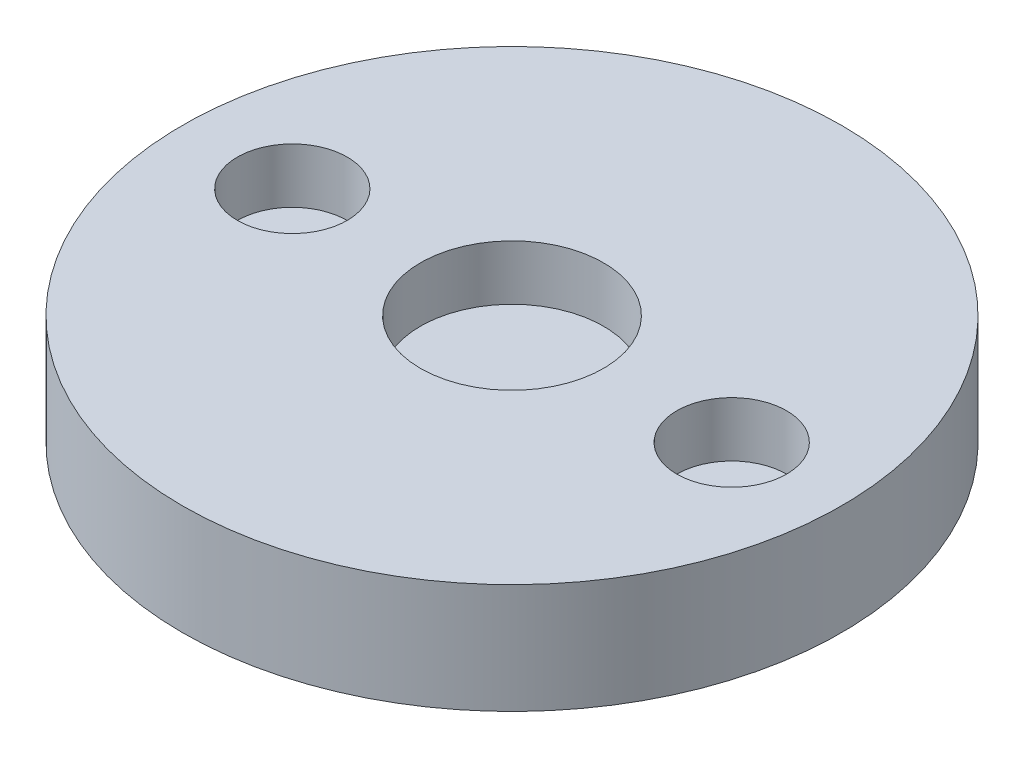
ISO-10303-21;
HEADER;
FILE_DESCRIPTION(('STEP AP214'),'2;1');
FILE_NAME('part.step','',(''),(''),'','','');
FILE_SCHEMA(('AUTOMOTIVE_DESIGN { 1 0 10303 214 1 1 1 1 }'));
ENDSEC;
DATA;
#1=APPLICATION_CONTEXT('core data for automotive mechanical design processes');
#2=APPLICATION_PROTOCOL_DEFINITION('international standard','automotive_design',2000,#1);
#3=PRODUCT_CONTEXT('',#1,'mechanical');
#4=PRODUCT('Part','Part','',(#3));
#5=PRODUCT_RELATED_PRODUCT_CATEGORY('part','',(#4));
#6=PRODUCT_DEFINITION_FORMATION('','',#4);
#7=PRODUCT_DEFINITION_CONTEXT('part definition',#1,'design');
#8=PRODUCT_DEFINITION('design','',#6,#7);
#9=PRODUCT_DEFINITION_SHAPE('','',#8);
#10=(LENGTH_UNIT() NAMED_UNIT(*) SI_UNIT(.MILLI.,.METRE.));
#11=(NAMED_UNIT(*) PLANE_ANGLE_UNIT() SI_UNIT($,.RADIAN.));
#12=(NAMED_UNIT(*) SI_UNIT($,.STERADIAN.) SOLID_ANGLE_UNIT());
#13=UNCERTAINTY_MEASURE_WITH_UNIT(LENGTH_MEASURE(1.E-05),#10,'distance_accuracy_value','');
#14=(GEOMETRIC_REPRESENTATION_CONTEXT(3) GLOBAL_UNCERTAINTY_ASSIGNED_CONTEXT((#13)) GLOBAL_UNIT_ASSIGNED_CONTEXT((#10,
#11,#12)) REPRESENTATION_CONTEXT('',''));
#15=CARTESIAN_POINT('',(0.,0.,0.));
#16=DIRECTION('',(0.,0.,1.));
#17=DIRECTION('',(1.,0.,0.));
#18=AXIS2_PLACEMENT_3D('',#15,#16,#17);
#19=CARTESIAN_POINT('',(0.,3.,0.));
#20=DIRECTION('',(0.,-1.,0.));
#21=DIRECTION('',(0.,0.,-1.));
#22=AXIS2_PLACEMENT_3D('',#19,#20,#21);
#23=CYLINDRICAL_SURFACE('',#22,9.);
#24=CARTESIAN_POINT('',(0.,3.,0.));
#25=DIRECTION('',(0.,1.,0.));
#26=DIRECTION('',(0.,0.,1.));
#27=AXIS2_PLACEMENT_3D('',#24,#25,#26);
#28=CIRCLE('',#27,9.);
#29=CARTESIAN_POINT('',(0.,3.,9.));
#30=VERTEX_POINT('',#29);
#31=EDGE_CURVE('E12',#30,#30,#28,.T.);
#32=ORIENTED_EDGE('',*,*,#31,.F.);
#33=EDGE_LOOP('',(#32));
#34=FACE_BOUND('',#33,.T.);
#35=CARTESIAN_POINT('',(0.,0.,0.));
#36=DIRECTION('',(0.,1.,0.));
#37=DIRECTION('',(0.,0.,1.));
#38=AXIS2_PLACEMENT_3D('',#35,#36,#37);
#39=CIRCLE('',#38,9.);
#40=CARTESIAN_POINT('',(0.,0.,9.));
#41=VERTEX_POINT('',#40);
#42=EDGE_CURVE('E46',#41,#41,#39,.T.);
#43=ORIENTED_EDGE('',*,*,#42,.T.);
#44=EDGE_LOOP('',(#43));
#45=FACE_BOUND('',#44,.T.);
#46=ADVANCED_FACE('F43',(#34,#45),#23,.T.);
#47=CARTESIAN_POINT('',(0.,3.,0.));
#48=DIRECTION('',(0.,1.,0.));
#49=DIRECTION('',(0.,0.,1.));
#50=AXIS2_PLACEMENT_3D('',#47,#48,#49);
#51=PLANE('',#50);
#52=CARTESIAN_POINT('',(6.,3.,0.));
#53=DIRECTION('',(0.,1.,0.));
#54=DIRECTION('',(0.,0.,1.));
#55=AXIS2_PLACEMENT_3D('',#52,#53,#54);
#56=CIRCLE('',#55,1.5);
#57=CARTESIAN_POINT('',(6.,3.,1.5));
#58=VERTEX_POINT('',#57);
#59=EDGE_CURVE('E61',#58,#58,#56,.T.);
#60=ORIENTED_EDGE('',*,*,#59,.F.);
#61=EDGE_LOOP('',(#60));
#62=FACE_BOUND('',#61,.T.);
#63=CARTESIAN_POINT('',(-6.,3.,0.));
#64=DIRECTION('',(0.,1.,0.));
#65=DIRECTION('',(0.,0.,1.));
#66=AXIS2_PLACEMENT_3D('',#63,#64,#65);
#67=CIRCLE('',#66,1.5);
#68=CARTESIAN_POINT('',(-6.,3.,1.5));
#69=VERTEX_POINT('',#68);
#70=EDGE_CURVE('E67',#69,#69,#67,.T.);
#71=ORIENTED_EDGE('',*,*,#70,.F.);
#72=EDGE_LOOP('',(#71));
#73=FACE_BOUND('',#72,.T.);
#74=CARTESIAN_POINT('',(0.,3.,0.));
#75=DIRECTION('',(0.,1.,0.));
#76=DIRECTION('',(0.,0.,1.));
#77=AXIS2_PLACEMENT_3D('',#74,#75,#76);
#78=CIRCLE('',#77,2.5);
#79=CARTESIAN_POINT('',(0.,3.,2.5));
#80=VERTEX_POINT('',#79);
#81=EDGE_CURVE('E55',#80,#80,#78,.T.);
#82=ORIENTED_EDGE('',*,*,#81,.F.);
#83=EDGE_LOOP('',(#82));
#84=FACE_BOUND('',#83,.T.);
#85=ORIENTED_EDGE('',*,*,#31,.T.);
#86=EDGE_LOOP('',(#85));
#87=FACE_BOUND('',#86,.T.);
#88=ADVANCED_FACE('F82',(#62,#73,#84,#87),#51,.T.);
#89=CARTESIAN_POINT('',(0.,0.,0.));
#90=DIRECTION('',(0.,1.,0.));
#91=DIRECTION('',(0.,0.,1.));
#92=AXIS2_PLACEMENT_3D('',#89,#90,#91);
#93=PLANE('',#92);
#94=ORIENTED_EDGE('',*,*,#42,.F.);
#95=EDGE_LOOP('',(#94));
#96=FACE_BOUND('',#95,.T.);
#97=ADVANCED_FACE('F85',(#96),#93,.F.);
#98=CARTESIAN_POINT('',(0.,1.5,0.));
#99=DIRECTION('',(0.,1.,0.));
#100=DIRECTION('',(0.,0.,1.));
#101=AXIS2_PLACEMENT_3D('',#98,#99,#100);
#102=CYLINDRICAL_SURFACE('',#101,2.5);
#103=CARTESIAN_POINT('',(0.,1.5,0.));
#104=DIRECTION('',(0.,1.,0.));
#105=DIRECTION('',(0.,0.,1.));
#106=AXIS2_PLACEMENT_3D('',#103,#104,#105);
#107=CIRCLE('',#106,2.5);
#108=CARTESIAN_POINT('',(0.,1.5,2.5));
#109=VERTEX_POINT('',#108);
#110=EDGE_CURVE('E53',#109,#109,#107,.T.);
#111=ORIENTED_EDGE('',*,*,#110,.F.);
#112=EDGE_LOOP('',(#111));
#113=FACE_BOUND('',#112,.T.);
#114=ORIENTED_EDGE('',*,*,#81,.T.);
#115=EDGE_LOOP('',(#114));
#116=FACE_BOUND('',#115,.T.);
#117=ADVANCED_FACE('F90',(#113,#116),#102,.F.);
#118=CARTESIAN_POINT('',(0.,1.5,0.));
#119=DIRECTION('',(0.,1.,0.));
#120=DIRECTION('',(0.,0.,1.));
#121=AXIS2_PLACEMENT_3D('',#118,#119,#120);
#122=PLANE('',#121);
#123=ORIENTED_EDGE('',*,*,#110,.T.);
#124=EDGE_LOOP('',(#123));
#125=FACE_BOUND('',#124,.T.);
#126=ADVANCED_FACE('F78',(#125),#122,.T.);
#127=CARTESIAN_POINT('',(-6.,1.5,0.));
#128=DIRECTION('',(0.,1.,0.));
#129=DIRECTION('',(0.,0.,1.));
#130=AXIS2_PLACEMENT_3D('',#127,#128,#129);
#131=CYLINDRICAL_SURFACE('',#130,1.5);
#132=CARTESIAN_POINT('',(-6.,1.5,0.));
#133=DIRECTION('',(0.,1.,0.));
#134=DIRECTION('',(0.,0.,1.));
#135=AXIS2_PLACEMENT_3D('',#132,#133,#134);
#136=CIRCLE('',#135,1.5);
#137=CARTESIAN_POINT('',(-6.,1.5,1.5));
#138=VERTEX_POINT('',#137);
#139=EDGE_CURVE('E58',#138,#138,#136,.T.);
#140=ORIENTED_EDGE('',*,*,#139,.F.);
#141=EDGE_LOOP('',(#140));
#142=FACE_BOUND('',#141,.T.);
#143=ORIENTED_EDGE('',*,*,#70,.T.);
#144=EDGE_LOOP('',(#143));
#145=FACE_BOUND('',#144,.T.);
#146=ADVANCED_FACE('F75',(#142,#145),#131,.F.);
#147=CARTESIAN_POINT('',(-6.,1.5,0.));
#148=DIRECTION('',(0.,1.,0.));
#149=DIRECTION('',(0.,0.,1.));
#150=AXIS2_PLACEMENT_3D('',#147,#148,#149);
#151=PLANE('',#150);
#152=ORIENTED_EDGE('',*,*,#139,.T.);
#153=EDGE_LOOP('',(#152));
#154=FACE_BOUND('',#153,.T.);
#155=ADVANCED_FACE('F73',(#154),#151,.T.);
#156=CARTESIAN_POINT('',(6.,1.5,0.));
#157=DIRECTION('',(0.,1.,0.));
#158=DIRECTION('',(0.,0.,1.));
#159=AXIS2_PLACEMENT_3D('',#156,#157,#158);
#160=CYLINDRICAL_SURFACE('',#159,1.5);
#161=CARTESIAN_POINT('',(6.,1.5,0.));
#162=DIRECTION('',(0.,1.,0.));
#163=DIRECTION('',(0.,0.,1.));
#164=AXIS2_PLACEMENT_3D('',#161,#162,#163);
#165=CIRCLE('',#164,1.5);
#166=CARTESIAN_POINT('',(6.,1.5,1.5));
#167=VERTEX_POINT('',#166);
#168=EDGE_CURVE('E64',#167,#167,#165,.T.);
#169=ORIENTED_EDGE('',*,*,#168,.F.);
#170=EDGE_LOOP('',(#169));
#171=FACE_BOUND('',#170,.T.);
#172=ORIENTED_EDGE('',*,*,#59,.T.);
#173=EDGE_LOOP('',(#172));
#174=FACE_BOUND('',#173,.T.);
#175=ADVANCED_FACE('F142',(#171,#174),#160,.F.);
#176=CARTESIAN_POINT('',(6.,1.5,0.));
#177=DIRECTION('',(0.,1.,0.));
#178=DIRECTION('',(0.,0.,1.));
#179=AXIS2_PLACEMENT_3D('',#176,#177,#178);
#180=PLANE('',#179);
#181=ORIENTED_EDGE('',*,*,#168,.T.);
#182=EDGE_LOOP('',(#181));
#183=FACE_BOUND('',#182,.T.);
#184=ADVANCED_FACE('F150',(#183),#180,.T.);
#185=CLOSED_SHELL('',(#46,#88,#97,#117,#126,#146,#155,#175,#184));
#186=MANIFOLD_SOLID_BREP('B2',#185);
#187=ADVANCED_BREP_SHAPE_REPRESENTATION('',(#18,#186),#14);
#188=SHAPE_DEFINITION_REPRESENTATION(#9,#187);
ENDSEC;
END-ISO-10303-21;
